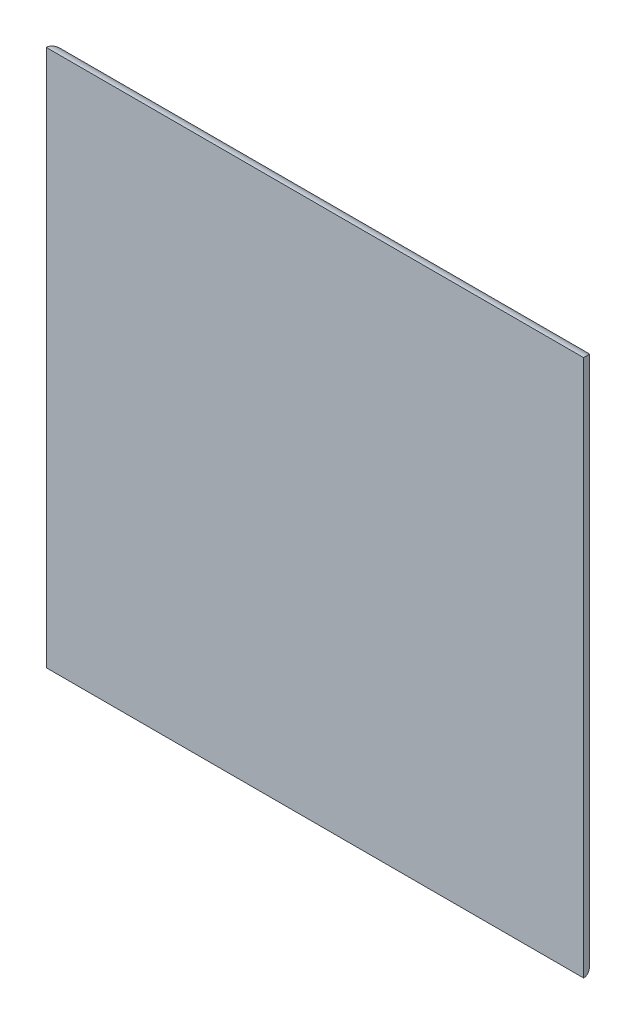
ISO-10303-21;
HEADER;
FILE_DESCRIPTION(('STEP AP214'),'2;1');
FILE_NAME('part.step','',(''),(''),'','','');
FILE_SCHEMA(('AUTOMOTIVE_DESIGN { 1 0 10303 214 1 1 1 1 }'));
ENDSEC;
DATA;
#1=APPLICATION_CONTEXT('core data for automotive mechanical design processes');
#2=APPLICATION_PROTOCOL_DEFINITION('international standard','automotive_design',2000,#1);
#3=PRODUCT_CONTEXT('',#1,'mechanical');
#4=PRODUCT('Part','Part','',(#3));
#5=PRODUCT_RELATED_PRODUCT_CATEGORY('part','',(#4));
#6=PRODUCT_DEFINITION_FORMATION('','',#4);
#7=PRODUCT_DEFINITION_CONTEXT('part definition',#1,'design');
#8=PRODUCT_DEFINITION('design','',#6,#7);
#9=PRODUCT_DEFINITION_SHAPE('','',#8);
#10=(LENGTH_UNIT() NAMED_UNIT(*) SI_UNIT(.MILLI.,.METRE.));
#11=(NAMED_UNIT(*) PLANE_ANGLE_UNIT() SI_UNIT($,.RADIAN.));
#12=(NAMED_UNIT(*) SI_UNIT($,.STERADIAN.) SOLID_ANGLE_UNIT());
#13=UNCERTAINTY_MEASURE_WITH_UNIT(LENGTH_MEASURE(1.E-05),#10,'distance_accuracy_value','');
#14=(GEOMETRIC_REPRESENTATION_CONTEXT(3) GLOBAL_UNCERTAINTY_ASSIGNED_CONTEXT((#13)) GLOBAL_UNIT_ASSIGNED_CONTEXT((#10,
#11,#12)) REPRESENTATION_CONTEXT('',''));
#15=CARTESIAN_POINT('',(0.,0.,0.));
#16=DIRECTION('',(0.,0.,1.));
#17=DIRECTION('',(1.,0.,0.));
#18=AXIS2_PLACEMENT_3D('',#15,#16,#17);
#19=CARTESIAN_POINT('',(9.,9.,0.25));
#20=DIRECTION('',(0.,0.,-1.));
#21=DIRECTION('',(-1.,0.,0.));
#22=AXIS2_PLACEMENT_3D('',#19,#20,#21);
#23=PLANE('',#22);
#24=DIRECTION('',(0.,1.,0.));
#25=VECTOR('',#24,1.);
#26=CARTESIAN_POINT('',(9.,-9.,0.25));
#27=LINE('',#26,#25);
#28=CARTESIAN_POINT('',(9.,-9.,0.25));
#29=VERTEX_POINT('',#28);
#30=CARTESIAN_POINT('',(9.,9.,0.25));
#31=VERTEX_POINT('',#30);
#32=EDGE_CURVE('E75',#29,#31,#27,.T.);
#33=ORIENTED_EDGE('',*,*,#32,.T.);
#34=DIRECTION('',(-1.,0.,0.));
#35=VECTOR('',#34,1.);
#36=CARTESIAN_POINT('',(-9.,9.,0.25));
#37=LINE('',#36,#35);
#38=CARTESIAN_POINT('',(-9.,9.,0.25));
#39=VERTEX_POINT('',#38);
#40=EDGE_CURVE('E77',#31,#39,#37,.T.);
#41=ORIENTED_EDGE('',*,*,#40,.T.);
#42=DIRECTION('',(0.,-1.,0.));
#43=VECTOR('',#42,1.);
#44=CARTESIAN_POINT('',(-9.,-9.,0.25));
#45=LINE('',#44,#43);
#46=CARTESIAN_POINT('',(-9.,-9.,0.25));
#47=VERTEX_POINT('',#46);
#48=EDGE_CURVE('E90',#39,#47,#45,.T.);
#49=ORIENTED_EDGE('',*,*,#48,.T.);
#50=DIRECTION('',(1.,0.,0.));
#51=VECTOR('',#50,1.);
#52=CARTESIAN_POINT('',(-9.,-9.,0.25));
#53=LINE('',#52,#51);
#54=EDGE_CURVE('E79',#47,#29,#53,.T.);
#55=ORIENTED_EDGE('',*,*,#54,.T.);
#56=EDGE_LOOP('',(#33,#41,#49,#55));
#57=FACE_BOUND('',#56,.T.);
#58=ADVANCED_FACE('F32',(#57),#23,.F.);
#59=CARTESIAN_POINT('',(9.,9.,-0.25));
#60=DIRECTION('',(0.,0.,-1.));
#61=DIRECTION('',(-1.,0.,0.));
#62=AXIS2_PLACEMENT_3D('',#59,#60,#61);
#63=PLANE('',#62);
#64=DIRECTION('',(0.,1.,0.));
#65=VECTOR('',#64,1.);
#66=CARTESIAN_POINT('',(8.5,-9.,-0.25));
#67=LINE('',#66,#65);
#68=CARTESIAN_POINT('',(8.5,8.5,-0.25));
#69=VERTEX_POINT('',#68);
#70=CARTESIAN_POINT('',(8.5,-8.5,-0.25));
#71=VERTEX_POINT('',#70);
#72=EDGE_CURVE('E93',#69,#71,#67,.F.);
#73=ORIENTED_EDGE('',*,*,#72,.T.);
#74=DIRECTION('',(1.,0.,0.));
#75=VECTOR('',#74,1.);
#76=CARTESIAN_POINT('',(-9.,-8.5,-0.25));
#77=LINE('',#76,#75);
#78=CARTESIAN_POINT('',(-8.5,-8.5,-0.25));
#79=VERTEX_POINT('',#78);
#80=EDGE_CURVE('E11',#71,#79,#77,.F.);
#81=ORIENTED_EDGE('',*,*,#80,.T.);
#82=DIRECTION('',(0.,-1.,0.));
#83=VECTOR('',#82,1.);
#84=CARTESIAN_POINT('',(-8.5,9.,-0.25));
#85=LINE('',#84,#83);
#86=CARTESIAN_POINT('',(-8.5,8.5,-0.25));
#87=VERTEX_POINT('',#86);
#88=EDGE_CURVE('E41',#79,#87,#85,.F.);
#89=ORIENTED_EDGE('',*,*,#88,.T.);
#90=DIRECTION('',(-1.,0.,0.));
#91=VECTOR('',#90,1.);
#92=CARTESIAN_POINT('',(9.,8.5,-0.25));
#93=LINE('',#92,#91);
#94=EDGE_CURVE('E99',#87,#69,#93,.F.);
#95=ORIENTED_EDGE('',*,*,#94,.T.);
#96=EDGE_LOOP('',(#73,#81,#89,#95));
#97=FACE_BOUND('',#96,.T.);
#98=ADVANCED_FACE('F106',(#97),#63,.T.);
#99=CARTESIAN_POINT('',(-9.,8.5,0.25));
#100=DIRECTION('',(1.,0.,0.));
#101=DIRECTION('',(0.,0.,-1.));
#102=AXIS2_PLACEMENT_3D('',#99,#100,#101);
#103=CYLINDRICAL_SURFACE('',#102,0.5);
#104=CARTESIAN_POINT('',(8.5,8.5,0.25));
#105=DIRECTION('',(0.707106781186547,-0.707106781186547,0.));
#106=DIRECTION('',(-0.707106781186547,-0.707106781186547,0.));
#107=AXIS2_PLACEMENT_3D('',#104,#105,#106);
#108=ELLIPSE('',#107,0.707106781186547,0.5);
#109=EDGE_CURVE('E86',#69,#31,#108,.T.);
#110=ORIENTED_EDGE('',*,*,#109,.F.);
#111=ORIENTED_EDGE('',*,*,#94,.F.);
#112=CARTESIAN_POINT('',(-8.5,8.5,0.25));
#113=DIRECTION('',(0.707106781186547,0.707106781186547,0.));
#114=DIRECTION('',(0.707106781186547,-0.707106781186547,0.));
#115=AXIS2_PLACEMENT_3D('',#112,#113,#114);
#116=ELLIPSE('',#115,0.707106781186547,0.5);
#117=EDGE_CURVE('E36',#39,#87,#116,.F.);
#118=ORIENTED_EDGE('',*,*,#117,.F.);
#119=ORIENTED_EDGE('',*,*,#40,.F.);
#120=EDGE_LOOP('',(#110,#111,#118,#119));
#121=FACE_BOUND('',#120,.T.);
#122=ADVANCED_FACE('F34',(#121),#103,.T.);
#123=CARTESIAN_POINT('',(-8.5,-9.,0.25));
#124=DIRECTION('',(0.,1.,0.));
#125=DIRECTION('',(0.,0.,1.));
#126=AXIS2_PLACEMENT_3D('',#123,#124,#125);
#127=CYLINDRICAL_SURFACE('',#126,0.5);
#128=ORIENTED_EDGE('',*,*,#117,.T.);
#129=ORIENTED_EDGE('',*,*,#88,.F.);
#130=CARTESIAN_POINT('',(-8.5,-8.5,0.25));
#131=DIRECTION('',(-0.707106781186547,0.707106781186547,0.));
#132=DIRECTION('',(0.707106781186547,0.707106781186547,0.));
#133=AXIS2_PLACEMENT_3D('',#130,#131,#132);
#134=ELLIPSE('',#133,0.707106781186547,0.5);
#135=EDGE_CURVE('E49',#47,#79,#134,.F.);
#136=ORIENTED_EDGE('',*,*,#135,.F.);
#137=ORIENTED_EDGE('',*,*,#48,.F.);
#138=EDGE_LOOP('',(#128,#129,#136,#137));
#139=FACE_BOUND('',#138,.T.);
#140=ADVANCED_FACE('F104',(#139),#127,.T.);
#141=CARTESIAN_POINT('',(8.5,-9.,0.25));
#142=DIRECTION('',(0.,-1.,0.));
#143=DIRECTION('',(0.,0.,-1.));
#144=AXIS2_PLACEMENT_3D('',#141,#142,#143);
#145=CYLINDRICAL_SURFACE('',#144,0.5);
#146=ORIENTED_EDGE('',*,*,#109,.T.);
#147=ORIENTED_EDGE('',*,*,#32,.F.);
#148=CARTESIAN_POINT('',(8.5,-8.5,0.25));
#149=DIRECTION('',(-0.707106781186547,-0.707106781186547,0.));
#150=DIRECTION('',(0.707106781186547,-0.707106781186547,0.));
#151=AXIS2_PLACEMENT_3D('',#148,#149,#150);
#152=ELLIPSE('',#151,0.707106781186547,0.5);
#153=EDGE_CURVE('E94',#71,#29,#152,.T.);
#154=ORIENTED_EDGE('',*,*,#153,.F.);
#155=ORIENTED_EDGE('',*,*,#72,.F.);
#156=EDGE_LOOP('',(#146,#147,#154,#155));
#157=FACE_BOUND('',#156,.T.);
#158=ADVANCED_FACE('F92',(#157),#145,.T.);
#159=CARTESIAN_POINT('',(-9.,-8.5,0.25));
#160=DIRECTION('',(-1.,0.,0.));
#161=DIRECTION('',(0.,0.,1.));
#162=AXIS2_PLACEMENT_3D('',#159,#160,#161);
#163=CYLINDRICAL_SURFACE('',#162,0.5);
#164=ORIENTED_EDGE('',*,*,#135,.T.);
#165=ORIENTED_EDGE('',*,*,#80,.F.);
#166=ORIENTED_EDGE('',*,*,#153,.T.);
#167=ORIENTED_EDGE('',*,*,#54,.F.);
#168=EDGE_LOOP('',(#164,#165,#166,#167));
#169=FACE_BOUND('',#168,.T.);
#170=ADVANCED_FACE('F105',(#169),#163,.T.);
#171=CLOSED_SHELL('',(#58,#98,#122,#140,#158,#170));
#172=MANIFOLD_SOLID_BREP('B2',#171);
#173=ADVANCED_BREP_SHAPE_REPRESENTATION('',(#18,#172),#14);
#174=SHAPE_DEFINITION_REPRESENTATION(#9,#173);
ENDSEC;
END-ISO-10303-21;
